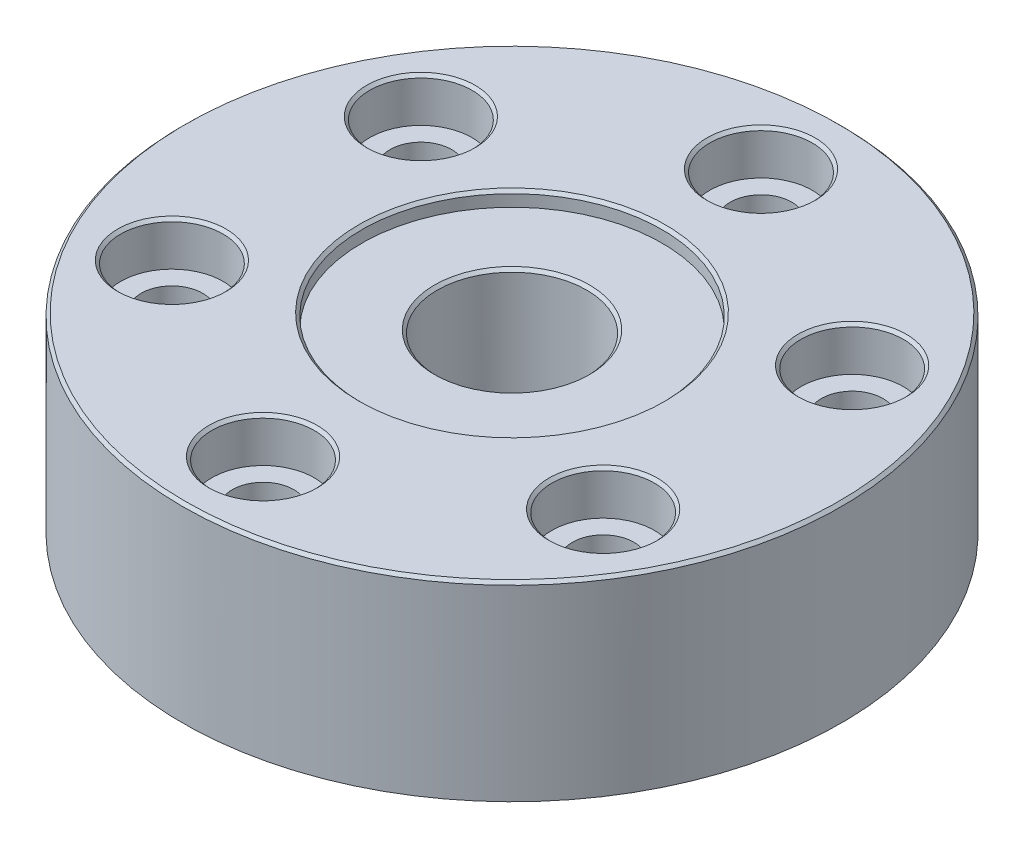
ISO-10303-21;
HEADER;
FILE_DESCRIPTION(('STEP AP214'),'2;1');
FILE_NAME('part.step','',(''),(''),'','','');
FILE_SCHEMA(('AUTOMOTIVE_DESIGN { 1 0 10303 214 1 1 1 1 }'));
ENDSEC;
DATA;
#1=APPLICATION_CONTEXT('core data for automotive mechanical design processes');
#2=APPLICATION_PROTOCOL_DEFINITION('international standard','automotive_design',2000,#1);
#3=PRODUCT_CONTEXT('',#1,'mechanical');
#4=PRODUCT('Part','Part','',(#3));
#5=PRODUCT_RELATED_PRODUCT_CATEGORY('part','',(#4));
#6=PRODUCT_DEFINITION_FORMATION('','',#4);
#7=PRODUCT_DEFINITION_CONTEXT('part definition',#1,'design');
#8=PRODUCT_DEFINITION('design','',#6,#7);
#9=PRODUCT_DEFINITION_SHAPE('','',#8);
#10=(LENGTH_UNIT() NAMED_UNIT(*) SI_UNIT(.MILLI.,.METRE.));
#11=(NAMED_UNIT(*) PLANE_ANGLE_UNIT() SI_UNIT($,.RADIAN.));
#12=(NAMED_UNIT(*) SI_UNIT($,.STERADIAN.) SOLID_ANGLE_UNIT());
#13=UNCERTAINTY_MEASURE_WITH_UNIT(LENGTH_MEASURE(1.E-05),#10,'distance_accuracy_value','');
#14=(GEOMETRIC_REPRESENTATION_CONTEXT(3) GLOBAL_UNCERTAINTY_ASSIGNED_CONTEXT((#13)) GLOBAL_UNIT_ASSIGNED_CONTEXT((#10,
#11,#12)) REPRESENTATION_CONTEXT('',''));
#15=CARTESIAN_POINT('',(0.,0.,0.));
#16=DIRECTION('',(0.,0.,1.));
#17=DIRECTION('',(1.,0.,0.));
#18=AXIS2_PLACEMENT_3D('',#15,#16,#17);
#19=CARTESIAN_POINT('',(0.,13.,0.));
#20=DIRECTION('',(0.,-1.,0.));
#21=DIRECTION('',(0.,0.,-1.));
#22=AXIS2_PLACEMENT_3D('',#19,#20,#21);
#23=CYLINDRICAL_SURFACE('',#22,22.5);
#24=CARTESIAN_POINT('',(0.,12.8,0.));
#25=DIRECTION('',(0.,1.,0.));
#26=DIRECTION('',(0.,0.,1.));
#27=AXIS2_PLACEMENT_3D('',#24,#25,#26);
#28=CIRCLE('',#27,22.5);
#29=CARTESIAN_POINT('',(0.,12.8,22.5));
#30=VERTEX_POINT('',#29);
#31=EDGE_CURVE('E10',#30,#30,#28,.F.);
#32=ORIENTED_EDGE('',*,*,#31,.T.);
#33=EDGE_LOOP('',(#32));
#34=FACE_BOUND('',#33,.T.);
#35=CARTESIAN_POINT('',(0.,0.,0.));
#36=DIRECTION('',(0.,-1.,0.));
#37=DIRECTION('',(0.,0.,-1.));
#38=AXIS2_PLACEMENT_3D('',#35,#36,#37);
#39=CIRCLE('',#38,22.5);
#40=CARTESIAN_POINT('',(0.,0.,-22.5));
#41=VERTEX_POINT('',#40);
#42=EDGE_CURVE('E127',#41,#41,#39,.T.);
#43=ORIENTED_EDGE('',*,*,#42,.F.);
#44=EDGE_LOOP('',(#43));
#45=FACE_BOUND('',#44,.T.);
#46=ADVANCED_FACE('F45',(#34,#45),#23,.T.);
#47=CARTESIAN_POINT('',(22.5,13.,0.));
#48=DIRECTION('',(0.,1.,0.));
#49=DIRECTION('',(0.,0.,1.));
#50=AXIS2_PLACEMENT_3D('',#47,#48,#49);
#51=PLANE('',#50);
#52=CARTESIAN_POINT('',(0.,13.,0.));
#53=DIRECTION('',(0.,1.,0.));
#54=DIRECTION('',(0.,0.,1.));
#55=AXIS2_PLACEMENT_3D('',#52,#53,#54);
#56=CIRCLE('',#55,10.45);
#57=CARTESIAN_POINT('',(0.,13.,10.4500000000001));
#58=VERTEX_POINT('',#57);
#59=EDGE_CURVE('E85',#58,#58,#56,.F.);
#60=ORIENTED_EDGE('',*,*,#59,.T.);
#61=EDGE_LOOP('',(#60));
#62=FACE_BOUND('',#61,.T.);
#63=CARTESIAN_POINT('',(14.7224318643355,13.,8.5));
#64=DIRECTION('',(0.,1.,0.));
#65=DIRECTION('',(0.,0.,1.));
#66=AXIS2_PLACEMENT_3D('',#63,#64,#65);
#67=CIRCLE('',#66,3.7);
#68=CARTESIAN_POINT('',(14.7224318643355,13.,12.2));
#69=VERTEX_POINT('',#68);
#70=EDGE_CURVE('E89',#69,#69,#67,.F.);
#71=ORIENTED_EDGE('',*,*,#70,.T.);
#72=EDGE_LOOP('',(#71));
#73=FACE_BOUND('',#72,.T.);
#74=CARTESIAN_POINT('',(0.,13.,17.));
#75=DIRECTION('',(0.,1.,0.));
#76=DIRECTION('',(0.,0.,1.));
#77=AXIS2_PLACEMENT_3D('',#74,#75,#76);
#78=CIRCLE('',#77,3.7);
#79=CARTESIAN_POINT('',(0.,13.,20.7));
#80=VERTEX_POINT('',#79);
#81=EDGE_CURVE('E93',#80,#80,#78,.F.);
#82=ORIENTED_EDGE('',*,*,#81,.T.);
#83=EDGE_LOOP('',(#82));
#84=FACE_BOUND('',#83,.T.);
#85=CARTESIAN_POINT('',(-14.7224318643355,13.,8.5));
#86=DIRECTION('',(0.,1.,0.));
#87=DIRECTION('',(0.,0.,1.));
#88=AXIS2_PLACEMENT_3D('',#85,#86,#87);
#89=CIRCLE('',#88,3.7);
#90=CARTESIAN_POINT('',(-14.7224318643355,13.,12.2));
#91=VERTEX_POINT('',#90);
#92=EDGE_CURVE('E97',#91,#91,#89,.F.);
#93=ORIENTED_EDGE('',*,*,#92,.T.);
#94=EDGE_LOOP('',(#93));
#95=FACE_BOUND('',#94,.T.);
#96=CARTESIAN_POINT('',(14.7224318643355,13.,-8.5));
#97=DIRECTION('',(0.,1.,0.));
#98=DIRECTION('',(0.,0.,1.));
#99=AXIS2_PLACEMENT_3D('',#96,#97,#98);
#100=CIRCLE('',#99,3.7);
#101=CARTESIAN_POINT('',(14.7224318643355,13.,-4.8));
#102=VERTEX_POINT('',#101);
#103=EDGE_CURVE('E101',#102,#102,#100,.F.);
#104=ORIENTED_EDGE('',*,*,#103,.T.);
#105=EDGE_LOOP('',(#104));
#106=FACE_BOUND('',#105,.T.);
#107=CARTESIAN_POINT('',(0.,13.,-17.));
#108=DIRECTION('',(0.,1.,0.));
#109=DIRECTION('',(0.,0.,1.));
#110=AXIS2_PLACEMENT_3D('',#107,#108,#109);
#111=CIRCLE('',#110,3.7);
#112=CARTESIAN_POINT('',(0.,13.,-13.3));
#113=VERTEX_POINT('',#112);
#114=EDGE_CURVE('E104',#113,#113,#111,.F.);
#115=ORIENTED_EDGE('',*,*,#114,.T.);
#116=EDGE_LOOP('',(#115));
#117=FACE_BOUND('',#116,.T.);
#118=CARTESIAN_POINT('',(-14.7224318643355,13.,-8.5));
#119=DIRECTION('',(0.,1.,0.));
#120=DIRECTION('',(0.,0.,1.));
#121=AXIS2_PLACEMENT_3D('',#118,#119,#120);
#122=CIRCLE('',#121,3.7);
#123=CARTESIAN_POINT('',(-14.7224318643355,13.,-4.8));
#124=VERTEX_POINT('',#123);
#125=EDGE_CURVE('E108',#124,#124,#122,.F.);
#126=ORIENTED_EDGE('',*,*,#125,.T.);
#127=EDGE_LOOP('',(#126));
#128=FACE_BOUND('',#127,.T.);
#129=CARTESIAN_POINT('',(0.,13.,0.));
#130=DIRECTION('',(0.,1.,0.));
#131=DIRECTION('',(0.,0.,1.));
#132=AXIS2_PLACEMENT_3D('',#129,#130,#131);
#133=CIRCLE('',#132,22.3);
#134=CARTESIAN_POINT('',(0.,13.,22.3));
#135=VERTEX_POINT('',#134);
#136=EDGE_CURVE('E111',#135,#135,#133,.T.);
#137=ORIENTED_EDGE('',*,*,#136,.T.);
#138=EDGE_LOOP('',(#137));
#139=FACE_BOUND('',#138,.T.);
#140=ADVANCED_FACE('F228',(#62,#73,#84,#95,#106,#117,#128,#139),#51,.T.);
#141=CARTESIAN_POINT('',(0.,0.,0.));
#142=DIRECTION('',(0.,-1.,0.));
#143=DIRECTION('',(0.,0.,-1.));
#144=AXIS2_PLACEMENT_3D('',#141,#142,#143);
#145=PLANE('',#144);
#146=CARTESIAN_POINT('',(0.,0.,0.));
#147=DIRECTION('',(0.,1.,0.));
#148=DIRECTION('',(0.,0.,1.));
#149=AXIS2_PLACEMENT_3D('',#146,#147,#148);
#150=CIRCLE('',#149,5.10000000000001);
#151=CARTESIAN_POINT('',(0.,0.,5.10000000000007));
#152=VERTEX_POINT('',#151);
#153=EDGE_CURVE('E202',#152,#152,#150,.T.);
#154=ORIENTED_EDGE('',*,*,#153,.T.);
#155=EDGE_LOOP('',(#154));
#156=FACE_BOUND('',#155,.T.);
#157=CARTESIAN_POINT('',(14.7224318643355,0.,-8.5));
#158=DIRECTION('',(0.,1.,0.));
#159=DIRECTION('',(0.,0.,1.));
#160=AXIS2_PLACEMENT_3D('',#157,#158,#159);
#161=CIRCLE('',#160,2.10000000000001);
#162=CARTESIAN_POINT('',(14.7224318643355,0.,-6.39999999999999));
#163=VERTEX_POINT('',#162);
#164=EDGE_CURVE('E190',#163,#163,#161,.T.);
#165=ORIENTED_EDGE('',*,*,#164,.T.);
#166=EDGE_LOOP('',(#165));
#167=FACE_BOUND('',#166,.T.);
#168=CARTESIAN_POINT('',(14.7224318643355,0.,8.5));
#169=DIRECTION('',(0.,1.,0.));
#170=DIRECTION('',(0.,0.,1.));
#171=AXIS2_PLACEMENT_3D('',#168,#169,#170);
#172=CIRCLE('',#171,2.10000000000001);
#173=CARTESIAN_POINT('',(14.7224318643355,0.,10.6));
#174=VERTEX_POINT('',#173);
#175=EDGE_CURVE('E178',#174,#174,#172,.T.);
#176=ORIENTED_EDGE('',*,*,#175,.T.);
#177=EDGE_LOOP('',(#176));
#178=FACE_BOUND('',#177,.T.);
#179=CARTESIAN_POINT('',(0.,0.,17.));
#180=DIRECTION('',(0.,1.,0.));
#181=DIRECTION('',(0.,0.,1.));
#182=AXIS2_PLACEMENT_3D('',#179,#180,#181);
#183=CIRCLE('',#182,2.10000000000001);
#184=CARTESIAN_POINT('',(0.,0.,19.1));
#185=VERTEX_POINT('',#184);
#186=EDGE_CURVE('E166',#185,#185,#183,.T.);
#187=ORIENTED_EDGE('',*,*,#186,.T.);
#188=EDGE_LOOP('',(#187));
#189=FACE_BOUND('',#188,.T.);
#190=CARTESIAN_POINT('',(-14.7224318643355,0.,8.5));
#191=DIRECTION('',(0.,1.,0.));
#192=DIRECTION('',(0.,0.,1.));
#193=AXIS2_PLACEMENT_3D('',#190,#191,#192);
#194=CIRCLE('',#193,2.10000000000001);
#195=CARTESIAN_POINT('',(-14.7224318643355,0.,10.6));
#196=VERTEX_POINT('',#195);
#197=EDGE_CURVE('E155',#196,#196,#194,.T.);
#198=ORIENTED_EDGE('',*,*,#197,.T.);
#199=EDGE_LOOP('',(#198));
#200=FACE_BOUND('',#199,.T.);
#201=CARTESIAN_POINT('',(-14.7224318643355,0.,-8.5));
#202=DIRECTION('',(0.,1.,0.));
#203=DIRECTION('',(0.,0.,1.));
#204=AXIS2_PLACEMENT_3D('',#201,#202,#203);
#205=CIRCLE('',#204,2.10000000000001);
#206=CARTESIAN_POINT('',(-14.7224318643355,0.,-6.39999999999999));
#207=VERTEX_POINT('',#206);
#208=EDGE_CURVE('E143',#207,#207,#205,.T.);
#209=ORIENTED_EDGE('',*,*,#208,.T.);
#210=EDGE_LOOP('',(#209));
#211=FACE_BOUND('',#210,.T.);
#212=CARTESIAN_POINT('',(0.,0.,-17.));
#213=DIRECTION('',(0.,1.,0.));
#214=DIRECTION('',(0.,0.,1.));
#215=AXIS2_PLACEMENT_3D('',#212,#213,#214);
#216=CIRCLE('',#215,2.10000000000001);
#217=CARTESIAN_POINT('',(0.,0.,-14.9));
#218=VERTEX_POINT('',#217);
#219=EDGE_CURVE('E131',#218,#218,#216,.T.);
#220=ORIENTED_EDGE('',*,*,#219,.T.);
#221=EDGE_LOOP('',(#220));
#222=FACE_BOUND('',#221,.T.);
#223=ORIENTED_EDGE('',*,*,#42,.T.);
#224=EDGE_LOOP('',(#223));
#225=FACE_BOUND('',#224,.T.);
#226=ADVANCED_FACE('F232',(#156,#167,#178,#189,#200,#211,#222,#225),#145,.T.);
#227=CARTESIAN_POINT('',(0.,13.,-17.));
#228=DIRECTION('',(0.,1.,0.));
#229=DIRECTION('',(0.,0.,1.));
#230=AXIS2_PLACEMENT_3D('',#227,#228,#229);
#231=CYLINDRICAL_SURFACE('',#230,2.10000000000001);
#232=ORIENTED_EDGE('',*,*,#219,.F.);
#233=EDGE_LOOP('',(#232));
#234=FACE_BOUND('',#233,.T.);
#235=CARTESIAN_POINT('',(0.,10.,-17.));
#236=DIRECTION('',(0.,1.,0.));
#237=DIRECTION('',(0.,0.,1.));
#238=AXIS2_PLACEMENT_3D('',#235,#236,#237);
#239=CIRCLE('',#238,2.10000000000001);
#240=CARTESIAN_POINT('',(0.,10.,-14.9));
#241=VERTEX_POINT('',#240);
#242=EDGE_CURVE('E135',#241,#241,#239,.T.);
#243=ORIENTED_EDGE('',*,*,#242,.T.);
#244=EDGE_LOOP('',(#243));
#245=FACE_BOUND('',#244,.T.);
#246=ADVANCED_FACE('F477',(#234,#245),#231,.F.);
#247=CARTESIAN_POINT('',(2.10000000000001,10.,-17.));
#248=DIRECTION('',(0.,-1.,0.));
#249=DIRECTION('',(0.,0.,-1.));
#250=AXIS2_PLACEMENT_3D('',#247,#248,#249);
#251=PLANE('',#250);
#252=ORIENTED_EDGE('',*,*,#242,.F.);
#253=EDGE_LOOP('',(#252));
#254=FACE_BOUND('',#253,.T.);
#255=CARTESIAN_POINT('',(0.,10.,-17.));
#256=DIRECTION('',(0.,1.,0.));
#257=DIRECTION('',(0.,0.,1.));
#258=AXIS2_PLACEMENT_3D('',#255,#256,#257);
#259=CIRCLE('',#258,3.5);
#260=CARTESIAN_POINT('',(0.,10.,-13.5));
#261=VERTEX_POINT('',#260);
#262=EDGE_CURVE('E139',#261,#261,#259,.T.);
#263=ORIENTED_EDGE('',*,*,#262,.T.);
#264=EDGE_LOOP('',(#263));
#265=FACE_BOUND('',#264,.T.);
#266=ADVANCED_FACE('F452',(#254,#265),#251,.F.);
#267=CARTESIAN_POINT('',(0.,13.,-17.));
#268=DIRECTION('',(0.,1.,0.));
#269=DIRECTION('',(0.,0.,1.));
#270=AXIS2_PLACEMENT_3D('',#267,#268,#269);
#271=CYLINDRICAL_SURFACE('',#270,3.5);
#272=CARTESIAN_POINT('',(0.,12.8,-17.));
#273=DIRECTION('',(0.,1.,0.));
#274=DIRECTION('',(0.,0.,1.));
#275=AXIS2_PLACEMENT_3D('',#272,#273,#274);
#276=CIRCLE('',#275,3.5);
#277=CARTESIAN_POINT('',(0.,12.8,-13.5));
#278=VERTEX_POINT('',#277);
#279=EDGE_CURVE('E61',#278,#278,#276,.T.);
#280=ORIENTED_EDGE('',*,*,#279,.T.);
#281=EDGE_LOOP('',(#280));
#282=FACE_BOUND('',#281,.T.);
#283=ORIENTED_EDGE('',*,*,#262,.F.);
#284=EDGE_LOOP('',(#283));
#285=FACE_BOUND('',#284,.T.);
#286=ADVANCED_FACE('F446',(#282,#285),#271,.F.);
#287=CARTESIAN_POINT('',(-14.7224318643355,13.,-8.5));
#288=DIRECTION('',(0.,1.,0.));
#289=DIRECTION('',(0.,0.,1.));
#290=AXIS2_PLACEMENT_3D('',#287,#288,#289);
#291=CYLINDRICAL_SURFACE('',#290,2.10000000000001);
#292=ORIENTED_EDGE('',*,*,#208,.F.);
#293=EDGE_LOOP('',(#292));
#294=FACE_BOUND('',#293,.T.);
#295=CARTESIAN_POINT('',(-14.7224318643355,10.,-8.5));
#296=DIRECTION('',(0.,1.,0.));
#297=DIRECTION('',(0.,0.,1.));
#298=AXIS2_PLACEMENT_3D('',#295,#296,#297);
#299=CIRCLE('',#298,2.10000000000001);
#300=CARTESIAN_POINT('',(-14.7224318643355,10.,-6.39999999999999));
#301=VERTEX_POINT('',#300);
#302=EDGE_CURVE('E147',#301,#301,#299,.T.);
#303=ORIENTED_EDGE('',*,*,#302,.T.);
#304=EDGE_LOOP('',(#303));
#305=FACE_BOUND('',#304,.T.);
#306=ADVANCED_FACE('F451',(#294,#305),#291,.F.);
#307=CARTESIAN_POINT('',(-12.6224318643354,10.,-8.5));
#308=DIRECTION('',(0.,-1.,0.));
#309=DIRECTION('',(0.,0.,-1.));
#310=AXIS2_PLACEMENT_3D('',#307,#308,#309);
#311=PLANE('',#310);
#312=ORIENTED_EDGE('',*,*,#302,.F.);
#313=EDGE_LOOP('',(#312));
#314=FACE_BOUND('',#313,.T.);
#315=CARTESIAN_POINT('',(-14.7224318643355,10.,-8.5));
#316=DIRECTION('',(0.,1.,0.));
#317=DIRECTION('',(0.,0.,1.));
#318=AXIS2_PLACEMENT_3D('',#315,#316,#317);
#319=CIRCLE('',#318,3.5);
#320=CARTESIAN_POINT('',(-14.7224318643355,10.,-5.));
#321=VERTEX_POINT('',#320);
#322=EDGE_CURVE('E151',#321,#321,#319,.T.);
#323=ORIENTED_EDGE('',*,*,#322,.T.);
#324=EDGE_LOOP('',(#323));
#325=FACE_BOUND('',#324,.T.);
#326=ADVANCED_FACE('F437',(#314,#325),#311,.F.);
#327=CARTESIAN_POINT('',(-14.7224318643355,13.,-8.5));
#328=DIRECTION('',(0.,1.,0.));
#329=DIRECTION('',(0.,0.,1.));
#330=AXIS2_PLACEMENT_3D('',#327,#328,#329);
#331=CYLINDRICAL_SURFACE('',#330,3.5);
#332=CARTESIAN_POINT('',(-14.7224318643355,12.8,-8.5));
#333=DIRECTION('',(0.,1.,0.));
#334=DIRECTION('',(0.,0.,1.));
#335=AXIS2_PLACEMENT_3D('',#332,#333,#334);
#336=CIRCLE('',#335,3.5);
#337=CARTESIAN_POINT('',(-14.7224318643355,12.8,-5.));
#338=VERTEX_POINT('',#337);
#339=EDGE_CURVE('E54',#338,#338,#336,.T.);
#340=ORIENTED_EDGE('',*,*,#339,.T.);
#341=EDGE_LOOP('',(#340));
#342=FACE_BOUND('',#341,.T.);
#343=ORIENTED_EDGE('',*,*,#322,.F.);
#344=EDGE_LOOP('',(#343));
#345=FACE_BOUND('',#344,.T.);
#346=ADVANCED_FACE('F431',(#342,#345),#331,.F.);
#347=CARTESIAN_POINT('',(-14.7224318643355,13.,8.5));
#348=DIRECTION('',(0.,1.,0.));
#349=DIRECTION('',(0.,0.,1.));
#350=AXIS2_PLACEMENT_3D('',#347,#348,#349);
#351=CYLINDRICAL_SURFACE('',#350,2.10000000000001);
#352=ORIENTED_EDGE('',*,*,#197,.F.);
#353=EDGE_LOOP('',(#352));
#354=FACE_BOUND('',#353,.T.);
#355=CARTESIAN_POINT('',(-14.7224318643355,10.,8.5));
#356=DIRECTION('',(0.,1.,0.));
#357=DIRECTION('',(0.,0.,1.));
#358=AXIS2_PLACEMENT_3D('',#355,#356,#357);
#359=CIRCLE('',#358,2.10000000000001);
#360=CARTESIAN_POINT('',(-14.7224318643355,10.,10.6));
#361=VERTEX_POINT('',#360);
#362=EDGE_CURVE('E159',#361,#361,#359,.T.);
#363=ORIENTED_EDGE('',*,*,#362,.T.);
#364=EDGE_LOOP('',(#363));
#365=FACE_BOUND('',#364,.T.);
#366=ADVANCED_FACE('F436',(#354,#365),#351,.F.);
#367=CARTESIAN_POINT('',(-12.6224318643354,10.,8.5));
#368=DIRECTION('',(0.,-1.,0.));
#369=DIRECTION('',(0.,0.,-1.));
#370=AXIS2_PLACEMENT_3D('',#367,#368,#369);
#371=PLANE('',#370);
#372=ORIENTED_EDGE('',*,*,#362,.F.);
#373=EDGE_LOOP('',(#372));
#374=FACE_BOUND('',#373,.T.);
#375=CARTESIAN_POINT('',(-14.7224318643355,10.,8.5));
#376=DIRECTION('',(0.,1.,0.));
#377=DIRECTION('',(0.,0.,1.));
#378=AXIS2_PLACEMENT_3D('',#375,#376,#377);
#379=CIRCLE('',#378,3.5);
#380=CARTESIAN_POINT('',(-14.7224318643355,10.,12.));
#381=VERTEX_POINT('',#380);
#382=EDGE_CURVE('E163',#381,#381,#379,.T.);
#383=ORIENTED_EDGE('',*,*,#382,.T.);
#384=EDGE_LOOP('',(#383));
#385=FACE_BOUND('',#384,.T.);
#386=ADVANCED_FACE('F421',(#374,#385),#371,.F.);
#387=CARTESIAN_POINT('',(-14.7224318643355,13.,8.5));
#388=DIRECTION('',(0.,1.,0.));
#389=DIRECTION('',(0.,0.,1.));
#390=AXIS2_PLACEMENT_3D('',#387,#388,#389);
#391=CYLINDRICAL_SURFACE('',#390,3.5);
#392=CARTESIAN_POINT('',(-14.7224318643355,12.8,8.5));
#393=DIRECTION('',(0.,1.,0.));
#394=DIRECTION('',(0.,0.,1.));
#395=AXIS2_PLACEMENT_3D('',#392,#393,#394);
#396=CIRCLE('',#395,3.5);
#397=CARTESIAN_POINT('',(-14.7224318643355,12.8,12.));
#398=VERTEX_POINT('',#397);
#399=EDGE_CURVE('E74',#398,#398,#396,.T.);
#400=ORIENTED_EDGE('',*,*,#399,.T.);
#401=EDGE_LOOP('',(#400));
#402=FACE_BOUND('',#401,.T.);
#403=ORIENTED_EDGE('',*,*,#382,.F.);
#404=EDGE_LOOP('',(#403));
#405=FACE_BOUND('',#404,.T.);
#406=ADVANCED_FACE('F415',(#402,#405),#391,.F.);
#407=CARTESIAN_POINT('',(0.,13.,17.));
#408=DIRECTION('',(0.,1.,0.));
#409=DIRECTION('',(0.,0.,1.));
#410=AXIS2_PLACEMENT_3D('',#407,#408,#409);
#411=CYLINDRICAL_SURFACE('',#410,2.10000000000001);
#412=ORIENTED_EDGE('',*,*,#186,.F.);
#413=EDGE_LOOP('',(#412));
#414=FACE_BOUND('',#413,.T.);
#415=CARTESIAN_POINT('',(0.,10.,17.));
#416=DIRECTION('',(0.,1.,0.));
#417=DIRECTION('',(0.,0.,1.));
#418=AXIS2_PLACEMENT_3D('',#415,#416,#417);
#419=CIRCLE('',#418,2.10000000000001);
#420=CARTESIAN_POINT('',(0.,10.,19.1));
#421=VERTEX_POINT('',#420);
#422=EDGE_CURVE('E170',#421,#421,#419,.T.);
#423=ORIENTED_EDGE('',*,*,#422,.T.);
#424=EDGE_LOOP('',(#423));
#425=FACE_BOUND('',#424,.T.);
#426=ADVANCED_FACE('F420',(#414,#425),#411,.F.);
#427=CARTESIAN_POINT('',(2.10000000000001,10.,17.));
#428=DIRECTION('',(0.,-1.,0.));
#429=DIRECTION('',(0.,0.,-1.));
#430=AXIS2_PLACEMENT_3D('',#427,#428,#429);
#431=PLANE('',#430);
#432=ORIENTED_EDGE('',*,*,#422,.F.);
#433=EDGE_LOOP('',(#432));
#434=FACE_BOUND('',#433,.T.);
#435=CARTESIAN_POINT('',(0.,10.,17.));
#436=DIRECTION('',(0.,1.,0.));
#437=DIRECTION('',(0.,0.,1.));
#438=AXIS2_PLACEMENT_3D('',#435,#436,#437);
#439=CIRCLE('',#438,3.5);
#440=CARTESIAN_POINT('',(0.,10.,20.5));
#441=VERTEX_POINT('',#440);
#442=EDGE_CURVE('E174',#441,#441,#439,.T.);
#443=ORIENTED_EDGE('',*,*,#442,.T.);
#444=EDGE_LOOP('',(#443));
#445=FACE_BOUND('',#444,.T.);
#446=ADVANCED_FACE('F405',(#434,#445),#431,.F.);
#447=CARTESIAN_POINT('',(0.,13.,17.));
#448=DIRECTION('',(0.,1.,0.));
#449=DIRECTION('',(0.,0.,1.));
#450=AXIS2_PLACEMENT_3D('',#447,#448,#449);
#451=CYLINDRICAL_SURFACE('',#450,3.5);
#452=CARTESIAN_POINT('',(0.,12.8,17.));
#453=DIRECTION('',(0.,1.,0.));
#454=DIRECTION('',(0.,0.,1.));
#455=AXIS2_PLACEMENT_3D('',#452,#453,#454);
#456=CIRCLE('',#455,3.5);
#457=CARTESIAN_POINT('',(0.,12.8,20.5));
#458=VERTEX_POINT('',#457);
#459=EDGE_CURVE('E78',#458,#458,#456,.T.);
#460=ORIENTED_EDGE('',*,*,#459,.T.);
#461=EDGE_LOOP('',(#460));
#462=FACE_BOUND('',#461,.T.);
#463=ORIENTED_EDGE('',*,*,#442,.F.);
#464=EDGE_LOOP('',(#463));
#465=FACE_BOUND('',#464,.T.);
#466=ADVANCED_FACE('F399',(#462,#465),#451,.F.);
#467=CARTESIAN_POINT('',(14.7224318643355,13.,8.5));
#468=DIRECTION('',(0.,1.,0.));
#469=DIRECTION('',(0.,0.,1.));
#470=AXIS2_PLACEMENT_3D('',#467,#468,#469);
#471=CYLINDRICAL_SURFACE('',#470,2.10000000000001);
#472=ORIENTED_EDGE('',*,*,#175,.F.);
#473=EDGE_LOOP('',(#472));
#474=FACE_BOUND('',#473,.T.);
#475=CARTESIAN_POINT('',(14.7224318643355,10.,8.5));
#476=DIRECTION('',(0.,1.,0.));
#477=DIRECTION('',(0.,0.,1.));
#478=AXIS2_PLACEMENT_3D('',#475,#476,#477);
#479=CIRCLE('',#478,2.10000000000001);
#480=CARTESIAN_POINT('',(14.7224318643355,10.,10.6));
#481=VERTEX_POINT('',#480);
#482=EDGE_CURVE('E182',#481,#481,#479,.T.);
#483=ORIENTED_EDGE('',*,*,#482,.T.);
#484=EDGE_LOOP('',(#483));
#485=FACE_BOUND('',#484,.T.);
#486=ADVANCED_FACE('F404',(#474,#485),#471,.F.);
#487=CARTESIAN_POINT('',(16.8224318643355,10.,8.5));
#488=DIRECTION('',(0.,-1.,0.));
#489=DIRECTION('',(0.,0.,-1.));
#490=AXIS2_PLACEMENT_3D('',#487,#488,#489);
#491=PLANE('',#490);
#492=ORIENTED_EDGE('',*,*,#482,.F.);
#493=EDGE_LOOP('',(#492));
#494=FACE_BOUND('',#493,.T.);
#495=CARTESIAN_POINT('',(14.7224318643355,10.,8.5));
#496=DIRECTION('',(0.,1.,0.));
#497=DIRECTION('',(0.,0.,1.));
#498=AXIS2_PLACEMENT_3D('',#495,#496,#497);
#499=CIRCLE('',#498,3.5);
#500=CARTESIAN_POINT('',(14.7224318643355,10.,12.));
#501=VERTEX_POINT('',#500);
#502=EDGE_CURVE('E186',#501,#501,#499,.T.);
#503=ORIENTED_EDGE('',*,*,#502,.T.);
#504=EDGE_LOOP('',(#503));
#505=FACE_BOUND('',#504,.T.);
#506=ADVANCED_FACE('F389',(#494,#505),#491,.F.);
#507=CARTESIAN_POINT('',(14.7224318643355,13.,8.5));
#508=DIRECTION('',(0.,1.,0.));
#509=DIRECTION('',(0.,0.,1.));
#510=AXIS2_PLACEMENT_3D('',#507,#508,#509);
#511=CYLINDRICAL_SURFACE('',#510,3.5);
#512=CARTESIAN_POINT('',(14.7224318643355,12.8,8.5));
#513=DIRECTION('',(0.,1.,0.));
#514=DIRECTION('',(0.,0.,1.));
#515=AXIS2_PLACEMENT_3D('',#512,#513,#514);
#516=CIRCLE('',#515,3.5);
#517=CARTESIAN_POINT('',(14.7224318643355,12.8,12.));
#518=VERTEX_POINT('',#517);
#519=EDGE_CURVE('E81',#518,#518,#516,.T.);
#520=ORIENTED_EDGE('',*,*,#519,.T.);
#521=EDGE_LOOP('',(#520));
#522=FACE_BOUND('',#521,.T.);
#523=ORIENTED_EDGE('',*,*,#502,.F.);
#524=EDGE_LOOP('',(#523));
#525=FACE_BOUND('',#524,.T.);
#526=ADVANCED_FACE('F383',(#522,#525),#511,.F.);
#527=CARTESIAN_POINT('',(14.7224318643355,13.,-8.5));
#528=DIRECTION('',(0.,1.,0.));
#529=DIRECTION('',(0.,0.,1.));
#530=AXIS2_PLACEMENT_3D('',#527,#528,#529);
#531=CYLINDRICAL_SURFACE('',#530,2.10000000000001);
#532=ORIENTED_EDGE('',*,*,#164,.F.);
#533=EDGE_LOOP('',(#532));
#534=FACE_BOUND('',#533,.T.);
#535=CARTESIAN_POINT('',(14.7224318643355,10.,-8.5));
#536=DIRECTION('',(0.,1.,0.));
#537=DIRECTION('',(0.,0.,1.));
#538=AXIS2_PLACEMENT_3D('',#535,#536,#537);
#539=CIRCLE('',#538,2.10000000000001);
#540=CARTESIAN_POINT('',(14.7224318643355,10.,-6.39999999999999));
#541=VERTEX_POINT('',#540);
#542=EDGE_CURVE('E194',#541,#541,#539,.T.);
#543=ORIENTED_EDGE('',*,*,#542,.T.);
#544=EDGE_LOOP('',(#543));
#545=FACE_BOUND('',#544,.T.);
#546=ADVANCED_FACE('F388',(#534,#545),#531,.F.);
#547=CARTESIAN_POINT('',(16.8224318643355,10.,-8.5));
#548=DIRECTION('',(0.,-1.,0.));
#549=DIRECTION('',(0.,0.,-1.));
#550=AXIS2_PLACEMENT_3D('',#547,#548,#549);
#551=PLANE('',#550);
#552=ORIENTED_EDGE('',*,*,#542,.F.);
#553=EDGE_LOOP('',(#552));
#554=FACE_BOUND('',#553,.T.);
#555=CARTESIAN_POINT('',(14.7224318643355,10.,-8.5));
#556=DIRECTION('',(0.,1.,0.));
#557=DIRECTION('',(0.,0.,1.));
#558=AXIS2_PLACEMENT_3D('',#555,#556,#557);
#559=CIRCLE('',#558,3.5);
#560=CARTESIAN_POINT('',(14.7224318643355,10.,-5.));
#561=VERTEX_POINT('',#560);
#562=EDGE_CURVE('E198',#561,#561,#559,.T.);
#563=ORIENTED_EDGE('',*,*,#562,.T.);
#564=EDGE_LOOP('',(#563));
#565=FACE_BOUND('',#564,.T.);
#566=ADVANCED_FACE('F375',(#554,#565),#551,.F.);
#567=CARTESIAN_POINT('',(14.7224318643355,13.,-8.5));
#568=DIRECTION('',(0.,1.,0.));
#569=DIRECTION('',(0.,0.,1.));
#570=AXIS2_PLACEMENT_3D('',#567,#568,#569);
#571=CYLINDRICAL_SURFACE('',#570,3.5);
#572=CARTESIAN_POINT('',(14.7224318643355,12.8,-8.5));
#573=DIRECTION('',(0.,1.,0.));
#574=DIRECTION('',(0.,0.,1.));
#575=AXIS2_PLACEMENT_3D('',#572,#573,#574);
#576=CIRCLE('',#575,3.5);
#577=CARTESIAN_POINT('',(14.7224318643355,12.8,-5.));
#578=VERTEX_POINT('',#577);
#579=EDGE_CURVE('E68',#578,#578,#576,.T.);
#580=ORIENTED_EDGE('',*,*,#579,.T.);
#581=EDGE_LOOP('',(#580));
#582=FACE_BOUND('',#581,.T.);
#583=ORIENTED_EDGE('',*,*,#562,.F.);
#584=EDGE_LOOP('',(#583));
#585=FACE_BOUND('',#584,.T.);
#586=ADVANCED_FACE('F365',(#582,#585),#571,.F.);
#587=CARTESIAN_POINT('',(0.,13.,0.));
#588=DIRECTION('',(0.,1.,0.));
#589=DIRECTION('',(0.,0.,1.));
#590=AXIS2_PLACEMENT_3D('',#587,#588,#589);
#591=CYLINDRICAL_SURFACE('',#590,5.10000000000001);
#592=CARTESIAN_POINT('',(0.,11.8,0.));
#593=DIRECTION('',(0.,-1.,0.));
#594=DIRECTION('',(0.,0.,-1.));
#595=AXIS2_PLACEMENT_3D('',#592,#593,#594);
#596=CIRCLE('',#595,5.10000000000001);
#597=CARTESIAN_POINT('',(0.,11.8,-5.09999999999996));
#598=VERTEX_POINT('',#597);
#599=EDGE_CURVE('E123',#598,#598,#596,.F.);
#600=ORIENTED_EDGE('',*,*,#599,.T.);
#601=EDGE_LOOP('',(#600));
#602=FACE_BOUND('',#601,.T.);
#603=ORIENTED_EDGE('',*,*,#153,.F.);
#604=EDGE_LOOP('',(#603));
#605=FACE_BOUND('',#604,.T.);
#606=ADVANCED_FACE('F224',(#602,#605),#591,.F.);
#607=CARTESIAN_POINT('',(5.09999999999997,12.,0.));
#608=DIRECTION('',(0.,-1.,0.));
#609=DIRECTION('',(0.,0.,-1.));
#610=AXIS2_PLACEMENT_3D('',#607,#608,#609);
#611=PLANE('',#610);
#612=CARTESIAN_POINT('',(0.,12.,0.));
#613=DIRECTION('',(0.,-1.,0.));
#614=DIRECTION('',(0.,0.,-1.));
#615=AXIS2_PLACEMENT_3D('',#612,#613,#614);
#616=CIRCLE('',#615,5.3);
#617=CARTESIAN_POINT('',(0.,12.,-5.29999999999994));
#618=VERTEX_POINT('',#617);
#619=EDGE_CURVE('E119',#618,#618,#616,.T.);
#620=ORIENTED_EDGE('',*,*,#619,.T.);
#621=EDGE_LOOP('',(#620));
#622=FACE_BOUND('',#621,.T.);
#623=CARTESIAN_POINT('',(0.,12.,0.));
#624=DIRECTION('',(0.,1.,0.));
#625=DIRECTION('',(0.,0.,1.));
#626=AXIS2_PLACEMENT_3D('',#623,#624,#625);
#627=CIRCLE('',#626,10.25);
#628=CARTESIAN_POINT('',(0.,12.,10.2500000000001));
#629=VERTEX_POINT('',#628);
#630=EDGE_CURVE('E206',#629,#629,#627,.T.);
#631=ORIENTED_EDGE('',*,*,#630,.T.);
#632=EDGE_LOOP('',(#631));
#633=FACE_BOUND('',#632,.T.);
#634=ADVANCED_FACE('F211',(#622,#633),#611,.F.);
#635=CARTESIAN_POINT('',(0.,13.,0.));
#636=DIRECTION('',(0.,1.,0.));
#637=DIRECTION('',(0.,0.,1.));
#638=AXIS2_PLACEMENT_3D('',#635,#636,#637);
#639=CYLINDRICAL_SURFACE('',#638,10.25);
#640=CARTESIAN_POINT('',(0.,12.8,0.));
#641=DIRECTION('',(0.,1.,0.));
#642=DIRECTION('',(0.,0.,1.));
#643=AXIS2_PLACEMENT_3D('',#640,#641,#642);
#644=CIRCLE('',#643,10.25);
#645=CARTESIAN_POINT('',(0.,12.8,10.2500000000001));
#646=VERTEX_POINT('',#645);
#647=EDGE_CURVE('E115',#646,#646,#644,.T.);
#648=ORIENTED_EDGE('',*,*,#647,.T.);
#649=EDGE_LOOP('',(#648));
#650=FACE_BOUND('',#649,.T.);
#651=ORIENTED_EDGE('',*,*,#630,.F.);
#652=EDGE_LOOP('',(#651));
#653=FACE_BOUND('',#652,.T.);
#654=ADVANCED_FACE('F213',(#650,#653),#639,.F.);
#655=CARTESIAN_POINT('',(0.,11.8,0.));
#656=DIRECTION('',(0.,1.,0.));
#657=DIRECTION('',(0.,0.,1.));
#658=AXIS2_PLACEMENT_3D('',#655,#656,#657);
#659=CONICAL_SURFACE('',#658,5.10000000000001,0.785398163397453);
#660=ORIENTED_EDGE('',*,*,#619,.F.);
#661=EDGE_LOOP('',(#660));
#662=FACE_BOUND('',#661,.T.);
#663=ORIENTED_EDGE('',*,*,#599,.F.);
#664=EDGE_LOOP('',(#663));
#665=FACE_BOUND('',#664,.T.);
#666=ADVANCED_FACE('F215',(#662,#665),#659,.F.);
#667=CARTESIAN_POINT('',(0.,12.8,0.));
#668=DIRECTION('',(0.,1.,0.));
#669=DIRECTION('',(0.,0.,1.));
#670=AXIS2_PLACEMENT_3D('',#667,#668,#669);
#671=CONICAL_SURFACE('',#670,10.25,0.785398163397448);
#672=ORIENTED_EDGE('',*,*,#59,.F.);
#673=EDGE_LOOP('',(#672));
#674=FACE_BOUND('',#673,.T.);
#675=ORIENTED_EDGE('',*,*,#647,.F.);
#676=EDGE_LOOP('',(#675));
#677=FACE_BOUND('',#676,.T.);
#678=ADVANCED_FACE('F221',(#674,#677),#671,.F.);
#679=CARTESIAN_POINT('',(14.7224318643355,12.8,8.5));
#680=DIRECTION('',(0.,1.,0.));
#681=DIRECTION('',(0.,0.,1.));
#682=AXIS2_PLACEMENT_3D('',#679,#680,#681);
#683=CONICAL_SURFACE('',#682,3.5,0.785398163397461);
#684=ORIENTED_EDGE('',*,*,#70,.F.);
#685=EDGE_LOOP('',(#684));
#686=FACE_BOUND('',#685,.T.);
#687=ORIENTED_EDGE('',*,*,#519,.F.);
#688=EDGE_LOOP('',(#687));
#689=FACE_BOUND('',#688,.T.);
#690=ADVANCED_FACE('F247',(#686,#689),#683,.F.);
#691=CARTESIAN_POINT('',(0.,12.8,17.));
#692=DIRECTION('',(0.,1.,0.));
#693=DIRECTION('',(0.,0.,1.));
#694=AXIS2_PLACEMENT_3D('',#691,#692,#693);
#695=CONICAL_SURFACE('',#694,3.5,0.785398163397461);
#696=ORIENTED_EDGE('',*,*,#81,.F.);
#697=EDGE_LOOP('',(#696));
#698=FACE_BOUND('',#697,.T.);
#699=ORIENTED_EDGE('',*,*,#459,.F.);
#700=EDGE_LOOP('',(#699));
#701=FACE_BOUND('',#700,.T.);
#702=ADVANCED_FACE('F254',(#698,#701),#695,.F.);
#703=CARTESIAN_POINT('',(-14.7224318643355,12.8,8.5));
#704=DIRECTION('',(0.,1.,0.));
#705=DIRECTION('',(0.,0.,1.));
#706=AXIS2_PLACEMENT_3D('',#703,#704,#705);
#707=CONICAL_SURFACE('',#706,3.5,0.785398163397457);
#708=ORIENTED_EDGE('',*,*,#92,.F.);
#709=EDGE_LOOP('',(#708));
#710=FACE_BOUND('',#709,.T.);
#711=ORIENTED_EDGE('',*,*,#399,.F.);
#712=EDGE_LOOP('',(#711));
#713=FACE_BOUND('',#712,.T.);
#714=ADVANCED_FACE('F261',(#710,#713),#707,.F.);
#715=CARTESIAN_POINT('',(14.7224318643355,12.8,-8.5));
#716=DIRECTION('',(0.,1.,0.));
#717=DIRECTION('',(0.,0.,1.));
#718=AXIS2_PLACEMENT_3D('',#715,#716,#717);
#719=CONICAL_SURFACE('',#718,3.5,0.785398163397461);
#720=ORIENTED_EDGE('',*,*,#103,.F.);
#721=EDGE_LOOP('',(#720));
#722=FACE_BOUND('',#721,.T.);
#723=ORIENTED_EDGE('',*,*,#579,.F.);
#724=EDGE_LOOP('',(#723));
#725=FACE_BOUND('',#724,.T.);
#726=ADVANCED_FACE('F268',(#722,#725),#719,.F.);
#727=CARTESIAN_POINT('',(0.,12.8,-17.));
#728=DIRECTION('',(0.,1.,0.));
#729=DIRECTION('',(0.,0.,1.));
#730=AXIS2_PLACEMENT_3D('',#727,#728,#729);
#731=CONICAL_SURFACE('',#730,3.5,0.785398163397461);
#732=ORIENTED_EDGE('',*,*,#114,.F.);
#733=EDGE_LOOP('',(#732));
#734=FACE_BOUND('',#733,.T.);
#735=ORIENTED_EDGE('',*,*,#279,.F.);
#736=EDGE_LOOP('',(#735));
#737=FACE_BOUND('',#736,.T.);
#738=ADVANCED_FACE('F275',(#734,#737),#731,.F.);
#739=CARTESIAN_POINT('',(-14.7224318643355,12.8,-8.5));
#740=DIRECTION('',(0.,1.,0.));
#741=DIRECTION('',(0.,0.,1.));
#742=AXIS2_PLACEMENT_3D('',#739,#740,#741);
#743=CONICAL_SURFACE('',#742,3.5,0.785398163397457);
#744=ORIENTED_EDGE('',*,*,#125,.F.);
#745=EDGE_LOOP('',(#744));
#746=FACE_BOUND('',#745,.T.);
#747=ORIENTED_EDGE('',*,*,#339,.F.);
#748=EDGE_LOOP('',(#747));
#749=FACE_BOUND('',#748,.T.);
#750=ADVANCED_FACE('F281',(#746,#749),#743,.F.);
#751=CARTESIAN_POINT('',(0.,12.8,0.));
#752=DIRECTION('',(0.,-1.,0.));
#753=DIRECTION('',(0.,0.,-1.));
#754=AXIS2_PLACEMENT_3D('',#751,#752,#753);
#755=CONICAL_SURFACE('',#754,22.5,0.78539816339744);
#756=ORIENTED_EDGE('',*,*,#136,.F.);
#757=EDGE_LOOP('',(#756));
#758=FACE_BOUND('',#757,.T.);
#759=ORIENTED_EDGE('',*,*,#31,.F.);
#760=EDGE_LOOP('',(#759));
#761=FACE_BOUND('',#760,.T.);
#762=ADVANCED_FACE('F48',(#758,#761),#755,.T.);
#763=CLOSED_SHELL('',(#46,#140,#226,#246,#266,#286,#306,#326,#346,#366,#386,#406,#426,#446,#466,
#486,#506,#526,#546,#566,#586,#606,#634,#654,#666,#678,#690,#702,#714,#726,#738,#750,#762));
#764=MANIFOLD_SOLID_BREP('B2',#763);
#765=ADVANCED_BREP_SHAPE_REPRESENTATION('',(#18,#764),#14);
#766=SHAPE_DEFINITION_REPRESENTATION(#9,#765);
ENDSEC;
END-ISO-10303-21;
